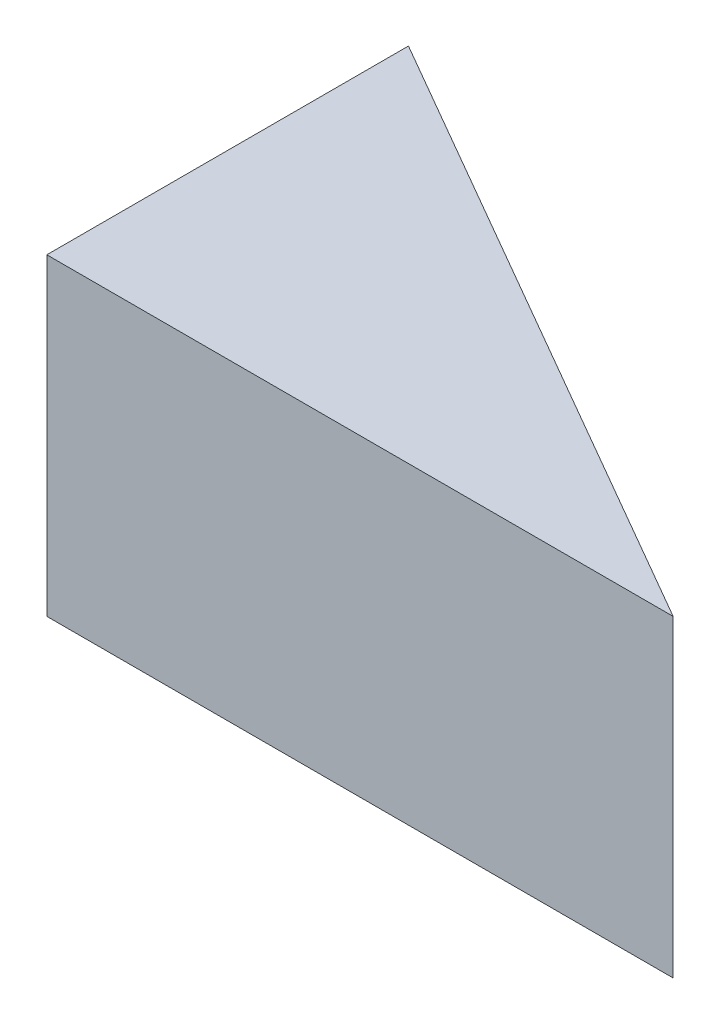
ISO-10303-21;
HEADER;
FILE_DESCRIPTION(('STEP AP214'),'2;1');
FILE_NAME('part.step','',(''),(''),'','','');
FILE_SCHEMA(('AUTOMOTIVE_DESIGN { 1 0 10303 214 1 1 1 1 }'));
ENDSEC;
DATA;
#1=APPLICATION_CONTEXT('core data for automotive mechanical design processes');
#2=APPLICATION_PROTOCOL_DEFINITION('international standard','automotive_design',2000,#1);
#3=PRODUCT_CONTEXT('',#1,'mechanical');
#4=PRODUCT('Part','Part','',(#3));
#5=PRODUCT_RELATED_PRODUCT_CATEGORY('part','',(#4));
#6=PRODUCT_DEFINITION_FORMATION('','',#4);
#7=PRODUCT_DEFINITION_CONTEXT('part definition',#1,'design');
#8=PRODUCT_DEFINITION('design','',#6,#7);
#9=PRODUCT_DEFINITION_SHAPE('','',#8);
#10=(LENGTH_UNIT() NAMED_UNIT(*) SI_UNIT(.MILLI.,.METRE.));
#11=(NAMED_UNIT(*) PLANE_ANGLE_UNIT() SI_UNIT($,.RADIAN.));
#12=(NAMED_UNIT(*) SI_UNIT($,.STERADIAN.) SOLID_ANGLE_UNIT());
#13=UNCERTAINTY_MEASURE_WITH_UNIT(LENGTH_MEASURE(1.E-05),#10,'distance_accuracy_value','');
#14=(GEOMETRIC_REPRESENTATION_CONTEXT(3) GLOBAL_UNCERTAINTY_ASSIGNED_CONTEXT((#13)) GLOBAL_UNIT_ASSIGNED_CONTEXT((#10,
#11,#12)) REPRESENTATION_CONTEXT('',''));
#15=CARTESIAN_POINT('',(0.,0.,0.));
#16=DIRECTION('',(0.,0.,1.));
#17=DIRECTION('',(1.,0.,0.));
#18=AXIS2_PLACEMENT_3D('',#15,#16,#17);
#19=CARTESIAN_POINT('',(0.,20.,-23.0940107675847));
#20=DIRECTION('',(1.,0.,0.));
#21=DIRECTION('',(0.,0.,-1.));
#22=AXIS2_PLACEMENT_3D('',#19,#20,#21);
#23=PLANE('',#22);
#24=DIRECTION('',(0.,0.,1.));
#25=VECTOR('',#24,1.);
#26=CARTESIAN_POINT('',(0.,0.,-23.0940107675847));
#27=LINE('',#26,#25);
#28=CARTESIAN_POINT('',(0.,0.,-23.0940107675847));
#29=VERTEX_POINT('',#28);
#30=CARTESIAN_POINT('',(0.,0.,0.));
#31=VERTEX_POINT('',#30);
#32=EDGE_CURVE('E89',#29,#31,#27,.T.);
#33=ORIENTED_EDGE('',*,*,#32,.T.);
#34=DIRECTION('',(0.,-1.,0.));
#35=VECTOR('',#34,1.);
#36=CARTESIAN_POINT('',(0.,20.,0.));
#37=LINE('',#36,#35);
#38=CARTESIAN_POINT('',(0.,20.,0.));
#39=VERTEX_POINT('',#38);
#40=EDGE_CURVE('E11',#39,#31,#37,.T.);
#41=ORIENTED_EDGE('',*,*,#40,.F.);
#42=DIRECTION('',(0.,0.,1.));
#43=VECTOR('',#42,1.);
#44=CARTESIAN_POINT('',(0.,20.,-23.0940107675847));
#45=LINE('',#44,#43);
#46=CARTESIAN_POINT('',(0.,20.,-23.0940107675847));
#47=VERTEX_POINT('',#46);
#48=EDGE_CURVE('E81',#47,#39,#45,.T.);
#49=ORIENTED_EDGE('',*,*,#48,.F.);
#50=DIRECTION('',(0.,-1.,0.));
#51=VECTOR('',#50,1.);
#52=CARTESIAN_POINT('',(0.,20.,-23.0940107675847));
#53=LINE('',#52,#51);
#54=EDGE_CURVE('E90',#47,#29,#53,.T.);
#55=ORIENTED_EDGE('',*,*,#54,.T.);
#56=EDGE_LOOP('',(#33,#41,#49,#55));
#57=FACE_BOUND('',#56,.T.);
#58=ADVANCED_FACE('F39',(#57),#23,.F.);
#59=CARTESIAN_POINT('',(0.,20.,0.));
#60=DIRECTION('',(0.,0.,-1.));
#61=DIRECTION('',(-1.,0.,0.));
#62=AXIS2_PLACEMENT_3D('',#59,#60,#61);
#63=PLANE('',#62);
#64=DIRECTION('',(1.,0.,0.));
#65=VECTOR('',#64,1.);
#66=CARTESIAN_POINT('',(0.,0.,0.));
#67=LINE('',#66,#65);
#68=CARTESIAN_POINT('',(40.,0.,0.));
#69=VERTEX_POINT('',#68);
#70=EDGE_CURVE('E68',#31,#69,#67,.T.);
#71=ORIENTED_EDGE('',*,*,#70,.T.);
#72=DIRECTION('',(0.,-1.,0.));
#73=VECTOR('',#72,1.);
#74=CARTESIAN_POINT('',(40.,20.,0.));
#75=LINE('',#74,#73);
#76=CARTESIAN_POINT('',(40.,20.,0.));
#77=VERTEX_POINT('',#76);
#78=EDGE_CURVE('E48',#77,#69,#75,.T.);
#79=ORIENTED_EDGE('',*,*,#78,.F.);
#80=DIRECTION('',(1.,0.,0.));
#81=VECTOR('',#80,1.);
#82=CARTESIAN_POINT('',(0.,20.,0.));
#83=LINE('',#82,#81);
#84=EDGE_CURVE('E76',#39,#77,#83,.T.);
#85=ORIENTED_EDGE('',*,*,#84,.F.);
#86=ORIENTED_EDGE('',*,*,#40,.T.);
#87=EDGE_LOOP('',(#71,#79,#85,#86));
#88=FACE_BOUND('',#87,.T.);
#89=ADVANCED_FACE('F77',(#88),#63,.F.);
#90=CARTESIAN_POINT('',(40.,20.,0.));
#91=DIRECTION('',(-0.499999999999995,0.,0.866025403784442));
#92=DIRECTION('',(0.866025403784442,0.,0.499999999999995));
#93=AXIS2_PLACEMENT_3D('',#90,#91,#92);
#94=PLANE('',#93);
#95=DIRECTION('',(-0.866025403784442,0.,-0.499999999999995));
#96=VECTOR('',#95,1.);
#97=CARTESIAN_POINT('',(40.,0.,0.));
#98=LINE('',#97,#96);
#99=EDGE_CURVE('E73',#69,#29,#98,.T.);
#100=ORIENTED_EDGE('',*,*,#99,.T.);
#101=ORIENTED_EDGE('',*,*,#54,.F.);
#102=DIRECTION('',(-0.866025403784442,0.,-0.499999999999995));
#103=VECTOR('',#102,1.);
#104=CARTESIAN_POINT('',(40.,20.,0.));
#105=LINE('',#104,#103);
#106=EDGE_CURVE('E56',#77,#47,#105,.T.);
#107=ORIENTED_EDGE('',*,*,#106,.F.);
#108=ORIENTED_EDGE('',*,*,#78,.T.);
#109=EDGE_LOOP('',(#100,#101,#107,#108));
#110=FACE_BOUND('',#109,.T.);
#111=ADVANCED_FACE('F102',(#110),#94,.F.);
#112=CARTESIAN_POINT('',(0.,20.,0.));
#113=DIRECTION('',(0.,1.,0.));
#114=DIRECTION('',(0.,0.,1.));
#115=AXIS2_PLACEMENT_3D('',#112,#113,#114);
#116=PLANE('',#115);
#117=ORIENTED_EDGE('',*,*,#48,.T.);
#118=ORIENTED_EDGE('',*,*,#84,.T.);
#119=ORIENTED_EDGE('',*,*,#106,.T.);
#120=EDGE_LOOP('',(#117,#118,#119));
#121=FACE_BOUND('',#120,.T.);
#122=ADVANCED_FACE('F84',(#121),#116,.T.);
#123=CARTESIAN_POINT('',(0.,0.,0.));
#124=DIRECTION('',(0.,1.,0.));
#125=DIRECTION('',(0.,0.,1.));
#126=AXIS2_PLACEMENT_3D('',#123,#124,#125);
#127=PLANE('',#126);
#128=ORIENTED_EDGE('',*,*,#32,.F.);
#129=ORIENTED_EDGE('',*,*,#99,.F.);
#130=ORIENTED_EDGE('',*,*,#70,.F.);
#131=EDGE_LOOP('',(#128,#129,#130));
#132=FACE_BOUND('',#131,.T.);
#133=ADVANCED_FACE('F103',(#132),#127,.F.);
#134=CLOSED_SHELL('',(#58,#89,#111,#122,#133));
#135=MANIFOLD_SOLID_BREP('B2',#134);
#136=ADVANCED_BREP_SHAPE_REPRESENTATION('',(#18,#135),#14);
#137=SHAPE_DEFINITION_REPRESENTATION(#9,#136);
ENDSEC;
END-ISO-10303-21;
